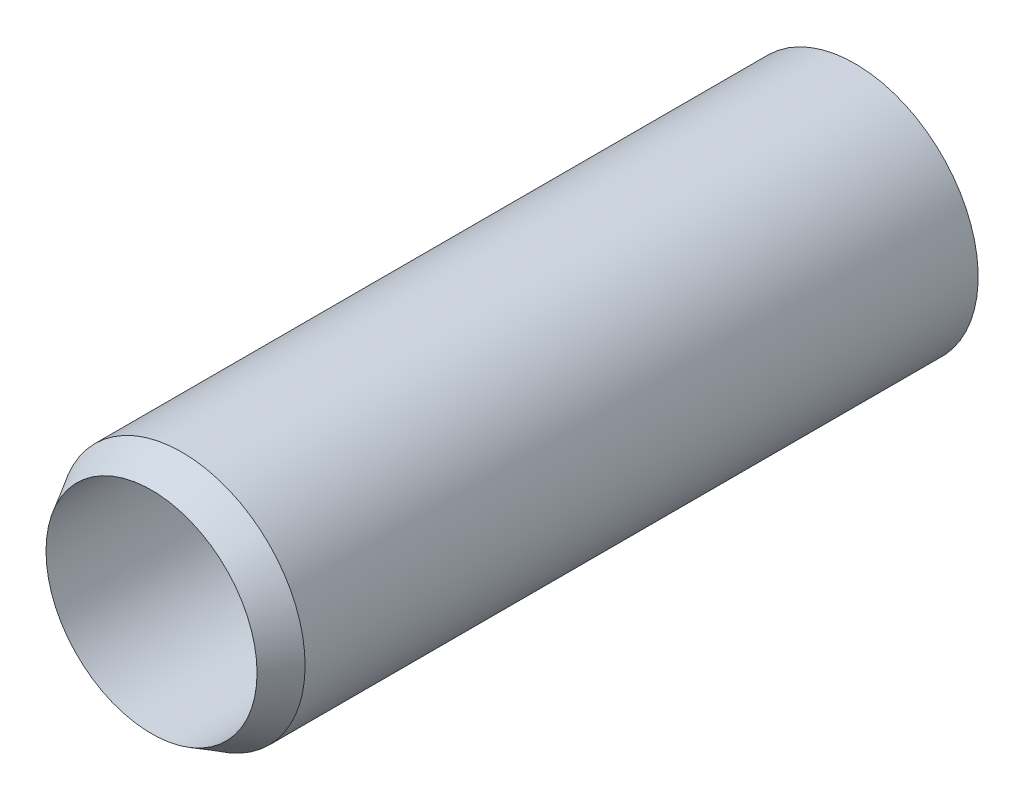
ISO-10303-21;
HEADER;
FILE_DESCRIPTION(('STEP AP214'),'2;1');
FILE_NAME('part.step','',(''),(''),'','','');
FILE_SCHEMA(('AUTOMOTIVE_DESIGN { 1 0 10303 214 1 1 1 1 }'));
ENDSEC;
DATA;
#1=APPLICATION_CONTEXT('core data for automotive mechanical design processes');
#2=APPLICATION_PROTOCOL_DEFINITION('international standard','automotive_design',2000,#1);
#3=PRODUCT_CONTEXT('',#1,'mechanical');
#4=PRODUCT('Part','Part','',(#3));
#5=PRODUCT_RELATED_PRODUCT_CATEGORY('part','',(#4));
#6=PRODUCT_DEFINITION_FORMATION('','',#4);
#7=PRODUCT_DEFINITION_CONTEXT('part definition',#1,'design');
#8=PRODUCT_DEFINITION('design','',#6,#7);
#9=PRODUCT_DEFINITION_SHAPE('','',#8);
#10=(LENGTH_UNIT() NAMED_UNIT(*) SI_UNIT(.MILLI.,.METRE.));
#11=(NAMED_UNIT(*) PLANE_ANGLE_UNIT() SI_UNIT($,.RADIAN.));
#12=(NAMED_UNIT(*) SI_UNIT($,.STERADIAN.) SOLID_ANGLE_UNIT());
#13=UNCERTAINTY_MEASURE_WITH_UNIT(LENGTH_MEASURE(1.E-05),#10,'distance_accuracy_value','');
#14=(GEOMETRIC_REPRESENTATION_CONTEXT(3) GLOBAL_UNCERTAINTY_ASSIGNED_CONTEXT((#13)) GLOBAL_UNIT_ASSIGNED_CONTEXT((#10,
#11,#12)) REPRESENTATION_CONTEXT('',''));
#15=CARTESIAN_POINT('',(0.,0.,0.));
#16=DIRECTION('',(0.,0.,1.));
#17=DIRECTION('',(1.,0.,0.));
#18=AXIS2_PLACEMENT_3D('',#15,#16,#17);
#19=CARTESIAN_POINT('',(-16.6201216578528,3.79310525370154,20.));
#20=DIRECTION('',(0.,0.,-1.));
#21=DIRECTION('',(-1.,0.,0.));
#22=AXIS2_PLACEMENT_3D('',#19,#20,#21);
#23=CYLINDRICAL_SURFACE('',#22,3.5);
#24=CARTESIAN_POINT('',(-16.6201216578528,3.79310525370154,19.1339745962156));
#25=DIRECTION('',(0.,0.,1.));
#26=DIRECTION('',(1.,0.,0.));
#27=AXIS2_PLACEMENT_3D('',#24,#25,#26);
#28=CIRCLE('',#27,3.5);
#29=CARTESIAN_POINT('',(-13.1201216578528,3.79310525370154,19.1339745962156));
#30=VERTEX_POINT('',#29);
#31=EDGE_CURVE('E10',#30,#30,#28,.F.);
#32=ORIENTED_EDGE('',*,*,#31,.T.);
#33=EDGE_LOOP('',(#32));
#34=FACE_BOUND('',#33,.T.);
#35=CARTESIAN_POINT('',(-16.6201216578528,3.79310525370154,0.));
#36=DIRECTION('',(0.,0.,-1.));
#37=DIRECTION('',(-1.,0.,0.));
#38=AXIS2_PLACEMENT_3D('',#35,#36,#37);
#39=CIRCLE('',#38,3.5);
#40=CARTESIAN_POINT('',(-20.1201216578527,3.79310525370154,0.));
#41=VERTEX_POINT('',#40);
#42=EDGE_CURVE('E46',#41,#41,#39,.T.);
#43=ORIENTED_EDGE('',*,*,#42,.F.);
#44=EDGE_LOOP('',(#43));
#45=FACE_BOUND('',#44,.T.);
#46=ADVANCED_FACE('F31',(#34,#45),#23,.T.);
#47=CARTESIAN_POINT('',(-16.6201216578528,3.79310525370154,20.));
#48=DIRECTION('',(0.,0.,-1.));
#49=DIRECTION('',(-1.,0.,0.));
#50=AXIS2_PLACEMENT_3D('',#47,#48,#49);
#51=CYLINDRICAL_SURFACE('',#50,3.);
#52=CARTESIAN_POINT('',(-16.6201216578528,3.79310525370154,0.));
#53=DIRECTION('',(0.,0.,-1.));
#54=DIRECTION('',(-1.,0.,0.));
#55=AXIS2_PLACEMENT_3D('',#52,#53,#54);
#56=CIRCLE('',#55,3.);
#57=CARTESIAN_POINT('',(-19.6201216578527,3.79310525370154,0.));
#58=VERTEX_POINT('',#57);
#59=EDGE_CURVE('E42',#58,#58,#56,.T.);
#60=ORIENTED_EDGE('',*,*,#59,.T.);
#61=EDGE_LOOP('',(#60));
#62=FACE_BOUND('',#61,.T.);
#63=CARTESIAN_POINT('',(-16.6201216578528,3.79310525370154,20.));
#64=DIRECTION('',(0.,0.,-1.));
#65=DIRECTION('',(-1.,0.,0.));
#66=AXIS2_PLACEMENT_3D('',#63,#64,#65);
#67=CIRCLE('',#66,3.);
#68=CARTESIAN_POINT('',(-19.6201216578528,3.79310525370154,20.));
#69=VERTEX_POINT('',#68);
#70=EDGE_CURVE('E38',#69,#69,#67,.T.);
#71=ORIENTED_EDGE('',*,*,#70,.F.);
#72=EDGE_LOOP('',(#71));
#73=FACE_BOUND('',#72,.T.);
#74=ADVANCED_FACE('F56',(#62,#73),#51,.F.);
#75=CARTESIAN_POINT('',(-13.6201216578528,3.79310525370154,0.));
#76=DIRECTION('',(0.,0.,-1.));
#77=DIRECTION('',(-1.,0.,0.));
#78=AXIS2_PLACEMENT_3D('',#75,#76,#77);
#79=PLANE('',#78);
#80=ORIENTED_EDGE('',*,*,#42,.T.);
#81=EDGE_LOOP('',(#80));
#82=FACE_BOUND('',#81,.T.);
#83=ORIENTED_EDGE('',*,*,#59,.F.);
#84=EDGE_LOOP('',(#83));
#85=FACE_BOUND('',#84,.T.);
#86=ADVANCED_FACE('F52',(#82,#85),#79,.T.);
#87=CARTESIAN_POINT('',(-16.6201216578528,3.79310525370154,19.1339745962156));
#88=DIRECTION('',(0.,0.,-1.));
#89=DIRECTION('',(-1.,0.,0.));
#90=AXIS2_PLACEMENT_3D('',#87,#88,#89);
#91=CONICAL_SURFACE('',#90,3.5,0.523598775598305);
#92=ORIENTED_EDGE('',*,*,#70,.T.);
#93=EDGE_LOOP('',(#92));
#94=FACE_BOUND('',#93,.T.);
#95=ORIENTED_EDGE('',*,*,#31,.F.);
#96=EDGE_LOOP('',(#95));
#97=FACE_BOUND('',#96,.T.);
#98=ADVANCED_FACE('F33',(#94,#97),#91,.T.);
#99=CLOSED_SHELL('',(#46,#74,#86,#98));
#100=MANIFOLD_SOLID_BREP('B2',#99);
#101=ADVANCED_BREP_SHAPE_REPRESENTATION('',(#18,#100),#14);
#102=SHAPE_DEFINITION_REPRESENTATION(#9,#101);
ENDSEC;
END-ISO-10303-21;
